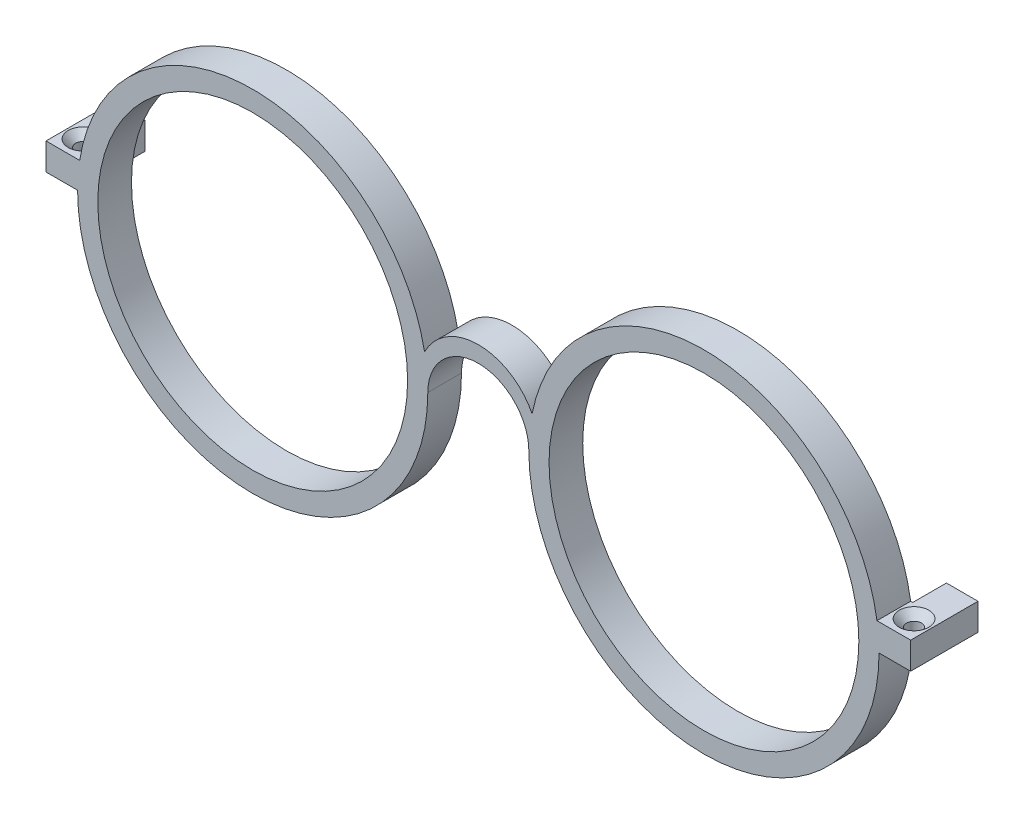
ISO-10303-21;
HEADER;
FILE_DESCRIPTION(('STEP AP214'),'2;1');
FILE_NAME('part.step','',(''),(''),'','','');
FILE_SCHEMA(('AUTOMOTIVE_DESIGN { 1 0 10303 214 1 1 1 1 }'));
ENDSEC;
DATA;
#1=APPLICATION_CONTEXT('core data for automotive mechanical design processes');
#2=APPLICATION_PROTOCOL_DEFINITION('international standard','automotive_design',2000,#1);
#3=PRODUCT_CONTEXT('',#1,'mechanical');
#4=PRODUCT('Part','Part','',(#3));
#5=PRODUCT_RELATED_PRODUCT_CATEGORY('part','',(#4));
#6=PRODUCT_DEFINITION_FORMATION('','',#4);
#7=PRODUCT_DEFINITION_CONTEXT('part definition',#1,'design');
#8=PRODUCT_DEFINITION('design','',#6,#7);
#9=PRODUCT_DEFINITION_SHAPE('','',#8);
#10=(LENGTH_UNIT() NAMED_UNIT(*) SI_UNIT(.MILLI.,.METRE.));
#11=(NAMED_UNIT(*) PLANE_ANGLE_UNIT() SI_UNIT($,.RADIAN.));
#12=(NAMED_UNIT(*) SI_UNIT($,.STERADIAN.) SOLID_ANGLE_UNIT());
#13=UNCERTAINTY_MEASURE_WITH_UNIT(LENGTH_MEASURE(1.E-05),#10,'distance_accuracy_value','');
#14=(GEOMETRIC_REPRESENTATION_CONTEXT(3) GLOBAL_UNCERTAINTY_ASSIGNED_CONTEXT((#13)) GLOBAL_UNIT_ASSIGNED_CONTEXT((#10,
#11,#12)) REPRESENTATION_CONTEXT('',''));
#15=CARTESIAN_POINT('',(0.,0.,0.));
#16=DIRECTION('',(0.,0.,1.));
#17=DIRECTION('',(1.,0.,0.));
#18=AXIS2_PLACEMENT_3D('',#15,#16,#17);
#19=CARTESIAN_POINT('',(0.,3.99999999999999,5.));
#20=DIRECTION('',(0.,-1.,0.));
#21=DIRECTION('',(1.,0.,0.));
#22=AXIS2_PLACEMENT_3D('',#19,#20,#21);
#23=PLANE('',#22);
#24=DIRECTION('',(0.,0.,-1.));
#25=VECTOR('',#24,1.);
#26=CARTESIAN_POINT('',(64.1904651573303,4.,5.));
#27=LINE('',#26,#25);
#28=CARTESIAN_POINT('',(64.1904651573303,4.,5.));
#29=VERTEX_POINT('',#28);
#30=CARTESIAN_POINT('',(64.1904651573303,4.,-5.));
#31=VERTEX_POINT('',#30);
#32=EDGE_CURVE('E191',#29,#31,#27,.T.);
#33=ORIENTED_EDGE('',*,*,#32,.T.);
#34=DIRECTION('',(1.,0.,0.));
#35=VECTOR('',#34,1.);
#36=CARTESIAN_POINT('',(64.1904651573303,4.,-5.));
#37=LINE('',#36,#35);
#38=CARTESIAN_POINT('',(59.5,4.,-5.));
#39=VERTEX_POINT('',#38);
#40=EDGE_CURVE('E234',#39,#31,#37,.T.);
#41=ORIENTED_EDGE('',*,*,#40,.F.);
#42=DIRECTION('',(0.,0.,1.));
#43=VECTOR('',#42,1.);
#44=CARTESIAN_POINT('',(59.5,4.,-5.));
#45=LINE('',#44,#43);
#46=CARTESIAN_POINT('',(59.5,4.,0.));
#47=VERTEX_POINT('',#46);
#48=EDGE_CURVE('E231',#39,#47,#45,.T.);
#49=ORIENTED_EDGE('',*,*,#48,.T.);
#50=DIRECTION('',(-1.,0.,0.));
#51=VECTOR('',#50,1.);
#52=CARTESIAN_POINT('',(0.,3.99999999999999,0.));
#53=LINE('',#52,#51);
#54=CARTESIAN_POINT('',(59.1904651573303,4.,0.));
#55=VERTEX_POINT('',#54);
#56=EDGE_CURVE('E187',#47,#55,#53,.T.);
#57=ORIENTED_EDGE('',*,*,#56,.T.);
#58=DIRECTION('',(0.,0.,-1.));
#59=VECTOR('',#58,1.);
#60=CARTESIAN_POINT('',(59.1904651573303,4.,5.));
#61=LINE('',#60,#59);
#62=CARTESIAN_POINT('',(59.1904651573303,4.,5.));
#63=VERTEX_POINT('',#62);
#64=EDGE_CURVE('E183',#63,#55,#61,.T.);
#65=ORIENTED_EDGE('',*,*,#64,.F.);
#66=DIRECTION('',(-1.,0.,0.));
#67=VECTOR('',#66,1.);
#68=CARTESIAN_POINT('',(0.,3.99999999999999,5.));
#69=LINE('',#68,#67);
#70=EDGE_CURVE('E169',#29,#63,#69,.T.);
#71=ORIENTED_EDGE('',*,*,#70,.F.);
#72=EDGE_LOOP('',(#33,#41,#49,#57,#65,#71));
#73=FACE_BOUND('',#72,.T.);
#74=CARTESIAN_POINT('',(61.6904651573303,4.,2.));
#75=DIRECTION('',(0.,1.,0.));
#76=DIRECTION('',(0.,0.,1.));
#77=AXIS2_PLACEMENT_3D('',#74,#75,#76);
#78=CIRCLE('',#77,2.19999999999999);
#79=CARTESIAN_POINT('',(61.6904651573303,4.,4.19999999999999));
#80=VERTEX_POINT('',#79);
#81=EDGE_CURVE('E607',#80,#80,#78,.T.);
#82=ORIENTED_EDGE('',*,*,#81,.F.);
#83=EDGE_LOOP('',(#82));
#84=FACE_BOUND('',#83,.T.);
#85=ADVANCED_FACE('F75',(#73,#84),#23,.F.);
#86=CARTESIAN_POINT('',(0.,0.,0.));
#87=DIRECTION('',(0.,0.,1.));
#88=DIRECTION('',(1.,0.,0.));
#89=AXIS2_PLACEMENT_3D('',#86,#87,#88);
#90=PLANE('',#89);
#91=CARTESIAN_POINT('',(33.5,0.,0.));
#92=DIRECTION('',(0.,0.,1.));
#93=DIRECTION('',(1.,0.,0.));
#94=AXIS2_PLACEMENT_3D('',#91,#92,#93);
#95=CIRCLE('',#94,23.);
#96=CARTESIAN_POINT('',(56.5,0.,0.));
#97=VERTEX_POINT('',#96);
#98=EDGE_CURVE('E220',#97,#97,#95,.T.);
#99=ORIENTED_EDGE('',*,*,#98,.T.);
#100=EDGE_LOOP('',(#99));
#101=FACE_BOUND('',#100,.T.);
#102=CARTESIAN_POINT('',(-33.5,0.,0.));
#103=DIRECTION('',(0.,0.,1.));
#104=DIRECTION('',(1.,0.,0.));
#105=AXIS2_PLACEMENT_3D('',#102,#103,#104);
#106=CIRCLE('',#105,23.);
#107=CARTESIAN_POINT('',(-10.5,0.,0.));
#108=VERTEX_POINT('',#107);
#109=EDGE_CURVE('E221',#108,#108,#106,.T.);
#110=ORIENTED_EDGE('',*,*,#109,.T.);
#111=EDGE_LOOP('',(#110));
#112=FACE_BOUND('',#111,.T.);
#113=DIRECTION('',(0.,-1.,0.));
#114=VECTOR('',#113,1.);
#115=CARTESIAN_POINT('',(-59.5,4.,0.));
#116=LINE('',#115,#114);
#117=CARTESIAN_POINT('',(-59.5,4.,0.));
#118=VERTEX_POINT('',#117);
#119=CARTESIAN_POINT('',(-59.5,0.,0.));
#120=VERTEX_POINT('',#119);
#121=EDGE_CURVE('E92',#118,#120,#116,.T.);
#122=ORIENTED_EDGE('',*,*,#121,.F.);
#123=DIRECTION('',(1.,0.,0.));
#124=VECTOR('',#123,1.);
#125=CARTESIAN_POINT('',(0.,4.,0.));
#126=LINE('',#125,#124);
#127=CARTESIAN_POINT('',(-59.1904651573303,4.,0.));
#128=VERTEX_POINT('',#127);
#129=EDGE_CURVE('E364',#118,#128,#126,.T.);
#130=ORIENTED_EDGE('',*,*,#129,.T.);
#131=CARTESIAN_POINT('',(-33.5,0.,0.));
#132=DIRECTION('',(0.,0.,1.));
#133=DIRECTION('',(1.,0.,0.));
#134=AXIS2_PLACEMENT_3D('',#131,#132,#133);
#135=CIRCLE('',#134,26.);
#136=CARTESIAN_POINT('',(-7.98076923076923,4.97683242100289,0.));
#137=VERTEX_POINT('',#136);
#138=EDGE_CURVE('E228',#137,#128,#135,.T.);
#139=ORIENTED_EDGE('',*,*,#138,.F.);
#140=CARTESIAN_POINT('',(0.00809188612239681,0.972483266629338,0.));
#141=DIRECTION('',(0.,0.,1.));
#142=DIRECTION('',(1.,0.,0.));
#143=AXIS2_PLACEMENT_3D('',#140,#141,#142);
#144=CIRCLE('',#143,8.93625839460315);
#145=CARTESIAN_POINT('',(7.98529835565385,5.00000000000003,0.));
#146=VERTEX_POINT('',#145);
#147=EDGE_CURVE('E353',#137,#146,#144,.F.);
#148=ORIENTED_EDGE('',*,*,#147,.T.);
#149=CARTESIAN_POINT('',(33.5,0.,0.));
#150=DIRECTION('',(0.,0.,1.));
#151=DIRECTION('',(1.,0.,0.));
#152=AXIS2_PLACEMENT_3D('',#149,#150,#151);
#153=CIRCLE('',#152,26.);
#154=EDGE_CURVE('E355',#55,#146,#153,.T.);
#155=ORIENTED_EDGE('',*,*,#154,.F.);
#156=ORIENTED_EDGE('',*,*,#56,.F.);
#157=DIRECTION('',(0.,1.,0.));
#158=VECTOR('',#157,1.);
#159=CARTESIAN_POINT('',(59.5,4.,0.));
#160=LINE('',#159,#158);
#161=CARTESIAN_POINT('',(59.5,0.,0.));
#162=VERTEX_POINT('',#161);
#163=EDGE_CURVE('E237',#162,#47,#160,.T.);
#164=ORIENTED_EDGE('',*,*,#163,.F.);
#165=CARTESIAN_POINT('',(7.49999999999999,0.,0.));
#166=VERTEX_POINT('',#165);
#167=EDGE_CURVE('E358',#166,#162,#153,.T.);
#168=ORIENTED_EDGE('',*,*,#167,.F.);
#169=CARTESIAN_POINT('',(0.,0.,0.));
#170=DIRECTION('',(0.,0.,1.));
#171=DIRECTION('',(1.,0.,0.));
#172=AXIS2_PLACEMENT_3D('',#169,#170,#171);
#173=CIRCLE('',#172,7.49999999999999);
#174=CARTESIAN_POINT('',(-7.5,0.,0.));
#175=VERTEX_POINT('',#174);
#176=EDGE_CURVE('E361',#175,#166,#173,.F.);
#177=ORIENTED_EDGE('',*,*,#176,.F.);
#178=EDGE_CURVE('E363',#120,#175,#135,.T.);
#179=ORIENTED_EDGE('',*,*,#178,.F.);
#180=EDGE_LOOP('',(#122,#130,#139,#148,#155,#156,#164,#168,#177,#179));
#181=FACE_BOUND('',#180,.T.);
#182=ADVANCED_FACE('F376',(#101,#112,#181),#90,.F.);
#183=CARTESIAN_POINT('',(0.,0.,5.));
#184=DIRECTION('',(0.,0.,1.));
#185=DIRECTION('',(1.,0.,0.));
#186=AXIS2_PLACEMENT_3D('',#183,#184,#185);
#187=PLANE('',#186);
#188=CARTESIAN_POINT('',(33.5,0.,5.));
#189=DIRECTION('',(0.,0.,1.));
#190=DIRECTION('',(1.,0.,0.));
#191=AXIS2_PLACEMENT_3D('',#188,#189,#190);
#192=CIRCLE('',#191,23.);
#193=CARTESIAN_POINT('',(56.5,0.,5.));
#194=VERTEX_POINT('',#193);
#195=EDGE_CURVE('E198',#194,#194,#192,.T.);
#196=ORIENTED_EDGE('',*,*,#195,.F.);
#197=EDGE_LOOP('',(#196));
#198=FACE_BOUND('',#197,.T.);
#199=CARTESIAN_POINT('',(-33.5,0.,5.));
#200=DIRECTION('',(0.,0.,1.));
#201=DIRECTION('',(1.,0.,0.));
#202=AXIS2_PLACEMENT_3D('',#199,#200,#201);
#203=CIRCLE('',#202,26.);
#204=CARTESIAN_POINT('',(-7.98076923076923,4.97683242100289,5.));
#205=VERTEX_POINT('',#204);
#206=CARTESIAN_POINT('',(-59.1904651573303,4.,5.));
#207=VERTEX_POINT('',#206);
#208=EDGE_CURVE('E139',#205,#207,#203,.T.);
#209=ORIENTED_EDGE('',*,*,#208,.T.);
#210=DIRECTION('',(1.,0.,0.));
#211=VECTOR('',#210,1.);
#212=CARTESIAN_POINT('',(0.,4.,5.));
#213=LINE('',#212,#211);
#214=CARTESIAN_POINT('',(-64.1904651573303,4.,5.));
#215=VERTEX_POINT('',#214);
#216=EDGE_CURVE('E217',#215,#207,#213,.T.);
#217=ORIENTED_EDGE('',*,*,#216,.F.);
#218=DIRECTION('',(0.,1.,0.));
#219=VECTOR('',#218,1.);
#220=CARTESIAN_POINT('',(-64.1904651573303,0.,5.));
#221=LINE('',#220,#219);
#222=CARTESIAN_POINT('',(-64.1904651573303,0.,5.));
#223=VERTEX_POINT('',#222);
#224=EDGE_CURVE('E214',#223,#215,#221,.T.);
#225=ORIENTED_EDGE('',*,*,#224,.F.);
#226=DIRECTION('',(-1.,0.,0.));
#227=VECTOR('',#226,1.);
#228=CARTESIAN_POINT('',(0.,0.,5.));
#229=LINE('',#228,#227);
#230=CARTESIAN_POINT('',(-59.5,0.,5.));
#231=VERTEX_POINT('',#230);
#232=EDGE_CURVE('E209',#231,#223,#229,.T.);
#233=ORIENTED_EDGE('',*,*,#232,.F.);
#234=CARTESIAN_POINT('',(-7.5,0.,5.));
#235=VERTEX_POINT('',#234);
#236=EDGE_CURVE('E206',#231,#235,#203,.T.);
#237=ORIENTED_EDGE('',*,*,#236,.T.);
#238=CARTESIAN_POINT('',(0.,0.,5.));
#239=DIRECTION('',(0.,0.,1.));
#240=DIRECTION('',(1.,0.,0.));
#241=AXIS2_PLACEMENT_3D('',#238,#239,#240);
#242=CIRCLE('',#241,7.49999999999999);
#243=CARTESIAN_POINT('',(7.49999999999999,0.,5.));
#244=VERTEX_POINT('',#243);
#245=EDGE_CURVE('E203',#235,#244,#242,.F.);
#246=ORIENTED_EDGE('',*,*,#245,.T.);
#247=CARTESIAN_POINT('',(33.5,0.,5.));
#248=DIRECTION('',(0.,0.,1.));
#249=DIRECTION('',(1.,0.,0.));
#250=AXIS2_PLACEMENT_3D('',#247,#248,#249);
#251=CIRCLE('',#250,26.);
#252=CARTESIAN_POINT('',(59.5,0.,5.));
#253=VERTEX_POINT('',#252);
#254=EDGE_CURVE('E197',#244,#253,#251,.T.);
#255=ORIENTED_EDGE('',*,*,#254,.T.);
#256=DIRECTION('',(1.,0.,0.));
#257=VECTOR('',#256,1.);
#258=CARTESIAN_POINT('',(0.,0.,5.));
#259=LINE('',#258,#257);
#260=CARTESIAN_POINT('',(64.1904651573303,0.,5.));
#261=VERTEX_POINT('',#260);
#262=EDGE_CURVE('E202',#253,#261,#259,.T.);
#263=ORIENTED_EDGE('',*,*,#262,.T.);
#264=DIRECTION('',(0.,1.,0.));
#265=VECTOR('',#264,1.);
#266=CARTESIAN_POINT('',(64.1904651573303,0.,5.));
#267=LINE('',#266,#265);
#268=EDGE_CURVE('E177',#261,#29,#267,.T.);
#269=ORIENTED_EDGE('',*,*,#268,.T.);
#270=ORIENTED_EDGE('',*,*,#70,.T.);
#271=CARTESIAN_POINT('',(7.98529835565385,5.00000000000003,5.));
#272=VERTEX_POINT('',#271);
#273=EDGE_CURVE('E174',#63,#272,#251,.T.);
#274=ORIENTED_EDGE('',*,*,#273,.T.);
#275=CARTESIAN_POINT('',(0.00809188612239681,0.972483266629338,5.));
#276=DIRECTION('',(0.,0.,1.));
#277=DIRECTION('',(1.,0.,0.));
#278=AXIS2_PLACEMENT_3D('',#275,#276,#277);
#279=CIRCLE('',#278,8.93625839460315);
#280=EDGE_CURVE('E195',#205,#272,#279,.F.);
#281=ORIENTED_EDGE('',*,*,#280,.F.);
#282=EDGE_LOOP('',(#209,#217,#225,#233,#237,#246,#255,#263,#269,#270,#274,#281));
#283=FACE_BOUND('',#282,.T.);
#284=CARTESIAN_POINT('',(-33.5,0.,5.));
#285=DIRECTION('',(0.,0.,1.));
#286=DIRECTION('',(1.,0.,0.));
#287=AXIS2_PLACEMENT_3D('',#284,#285,#286);
#288=CIRCLE('',#287,23.);
#289=CARTESIAN_POINT('',(-10.5,0.,5.));
#290=VERTEX_POINT('',#289);
#291=EDGE_CURVE('E224',#290,#290,#288,.T.);
#292=ORIENTED_EDGE('',*,*,#291,.F.);
#293=EDGE_LOOP('',(#292));
#294=FACE_BOUND('',#293,.T.);
#295=ADVANCED_FACE('F171',(#198,#283,#294),#187,.T.);
#296=CARTESIAN_POINT('',(-33.5,0.,5.));
#297=DIRECTION('',(0.,0.,-1.));
#298=DIRECTION('',(-1.,0.,0.));
#299=AXIS2_PLACEMENT_3D('',#296,#297,#298);
#300=CYLINDRICAL_SURFACE('',#299,26.);
#301=ORIENTED_EDGE('',*,*,#138,.T.);
#302=DIRECTION('',(0.,0.,-1.));
#303=VECTOR('',#302,1.);
#304=CARTESIAN_POINT('',(-59.1904651573303,4.,5.));
#305=LINE('',#304,#303);
#306=EDGE_CURVE('E12',#207,#128,#305,.T.);
#307=ORIENTED_EDGE('',*,*,#306,.F.);
#308=ORIENTED_EDGE('',*,*,#208,.F.);
#309=DIRECTION('',(0.,0.,-1.));
#310=VECTOR('',#309,1.);
#311=CARTESIAN_POINT('',(-7.98076923076923,4.97683242100289,5.));
#312=LINE('',#311,#310);
#313=EDGE_CURVE('E101',#205,#137,#312,.T.);
#314=ORIENTED_EDGE('',*,*,#313,.T.);
#315=EDGE_LOOP('',(#301,#307,#308,#314));
#316=FACE_BOUND('',#315,.T.);
#317=ADVANCED_FACE('F375',(#316),#300,.T.);
#318=CARTESIAN_POINT('',(0.,4.,5.));
#319=DIRECTION('',(0.,1.,0.));
#320=DIRECTION('',(0.,0.,1.));
#321=AXIS2_PLACEMENT_3D('',#318,#319,#320);
#322=PLANE('',#321);
#323=CARTESIAN_POINT('',(-61.6904651573303,3.99999999999998,2.));
#324=DIRECTION('',(0.,1.,0.));
#325=DIRECTION('',(0.,0.,1.));
#326=AXIS2_PLACEMENT_3D('',#323,#324,#325);
#327=CIRCLE('',#326,2.2);
#328=CARTESIAN_POINT('',(-61.6904651573303,3.99999999999998,4.2));
#329=VERTEX_POINT('',#328);
#330=EDGE_CURVE('E254',#329,#329,#327,.T.);
#331=ORIENTED_EDGE('',*,*,#330,.F.);
#332=EDGE_LOOP('',(#331));
#333=FACE_BOUND('',#332,.T.);
#334=ORIENTED_EDGE('',*,*,#129,.F.);
#335=DIRECTION('',(0.,0.,1.));
#336=VECTOR('',#335,1.);
#337=CARTESIAN_POINT('',(-59.5,4.,-5.));
#338=LINE('',#337,#336);
#339=CARTESIAN_POINT('',(-59.5,4.,-5.));
#340=VERTEX_POINT('',#339);
#341=EDGE_CURVE('E242',#340,#118,#338,.T.);
#342=ORIENTED_EDGE('',*,*,#341,.F.);
#343=DIRECTION('',(1.,0.,0.));
#344=VECTOR('',#343,1.);
#345=CARTESIAN_POINT('',(-64.1904651573303,4.,-5.));
#346=LINE('',#345,#344);
#347=CARTESIAN_POINT('',(-64.1904651573303,4.,-5.));
#348=VERTEX_POINT('',#347);
#349=EDGE_CURVE('E264',#348,#340,#346,.T.);
#350=ORIENTED_EDGE('',*,*,#349,.F.);
#351=DIRECTION('',(0.,0.,-1.));
#352=VECTOR('',#351,1.);
#353=CARTESIAN_POINT('',(-64.1904651573303,4.,5.));
#354=LINE('',#353,#352);
#355=EDGE_CURVE('E84',#215,#348,#354,.T.);
#356=ORIENTED_EDGE('',*,*,#355,.F.);
#357=ORIENTED_EDGE('',*,*,#216,.T.);
#358=ORIENTED_EDGE('',*,*,#306,.T.);
#359=EDGE_LOOP('',(#334,#342,#350,#356,#357,#358));
#360=FACE_BOUND('',#359,.T.);
#361=ADVANCED_FACE('F77',(#333,#360),#322,.T.);
#362=CARTESIAN_POINT('',(-64.1904651573303,0.,5.));
#363=DIRECTION('',(-1.,0.,0.));
#364=DIRECTION('',(0.,0.,1.));
#365=AXIS2_PLACEMENT_3D('',#362,#363,#364);
#366=PLANE('',#365);
#367=ORIENTED_EDGE('',*,*,#355,.T.);
#368=DIRECTION('',(0.,1.,0.));
#369=VECTOR('',#368,1.);
#370=CARTESIAN_POINT('',(-64.1904651573303,4.,-5.));
#371=LINE('',#370,#369);
#372=CARTESIAN_POINT('',(-64.1904651573303,0.,-5.));
#373=VERTEX_POINT('',#372);
#374=EDGE_CURVE('E251',#373,#348,#371,.T.);
#375=ORIENTED_EDGE('',*,*,#374,.F.);
#376=DIRECTION('',(0.,0.,-1.));
#377=VECTOR('',#376,1.);
#378=CARTESIAN_POINT('',(-64.1904651573303,0.,5.));
#379=LINE('',#378,#377);
#380=EDGE_CURVE('E326',#223,#373,#379,.T.);
#381=ORIENTED_EDGE('',*,*,#380,.F.);
#382=ORIENTED_EDGE('',*,*,#224,.T.);
#383=EDGE_LOOP('',(#367,#375,#381,#382));
#384=FACE_BOUND('',#383,.T.);
#385=ADVANCED_FACE('F323',(#384),#366,.T.);
#386=CARTESIAN_POINT('',(0.,0.,5.));
#387=DIRECTION('',(0.,-1.,0.));
#388=DIRECTION('',(1.,0.,0.));
#389=AXIS2_PLACEMENT_3D('',#386,#387,#388);
#390=PLANE('',#389);
#391=CARTESIAN_POINT('',(-61.6904651573303,0.,2.));
#392=DIRECTION('',(0.,-1.,0.));
#393=DIRECTION('',(1.,0.,0.));
#394=AXIS2_PLACEMENT_3D('',#391,#392,#393);
#395=CIRCLE('',#394,1.09999999999999);
#396=CARTESIAN_POINT('',(-60.5904651573303,0.,2.));
#397=VERTEX_POINT('',#396);
#398=EDGE_CURVE('E246',#397,#397,#395,.T.);
#399=ORIENTED_EDGE('',*,*,#398,.F.);
#400=EDGE_LOOP('',(#399));
#401=FACE_BOUND('',#400,.T.);
#402=ORIENTED_EDGE('',*,*,#380,.T.);
#403=DIRECTION('',(-1.,0.,0.));
#404=VECTOR('',#403,1.);
#405=CARTESIAN_POINT('',(-64.1904651573303,0.,-5.));
#406=LINE('',#405,#404);
#407=CARTESIAN_POINT('',(-59.5,0.,-5.));
#408=VERTEX_POINT('',#407);
#409=EDGE_CURVE('E270',#408,#373,#406,.T.);
#410=ORIENTED_EDGE('',*,*,#409,.F.);
#411=DIRECTION('',(0.,0.,1.));
#412=VECTOR('',#411,1.);
#413=CARTESIAN_POINT('',(-59.5,0.,-5.));
#414=LINE('',#413,#412);
#415=EDGE_CURVE('E272',#408,#120,#414,.T.);
#416=ORIENTED_EDGE('',*,*,#415,.T.);
#417=DIRECTION('',(0.,0.,-1.));
#418=VECTOR('',#417,1.);
#419=CARTESIAN_POINT('',(-59.5,0.,5.));
#420=LINE('',#419,#418);
#421=EDGE_CURVE('E337',#231,#120,#420,.T.);
#422=ORIENTED_EDGE('',*,*,#421,.F.);
#423=ORIENTED_EDGE('',*,*,#232,.T.);
#424=EDGE_LOOP('',(#402,#410,#416,#422,#423));
#425=FACE_BOUND('',#424,.T.);
#426=ADVANCED_FACE('F335',(#401,#425),#390,.T.);
#427=ORIENTED_EDGE('',*,*,#178,.T.);
#428=DIRECTION('',(0.,0.,-1.));
#429=VECTOR('',#428,1.);
#430=CARTESIAN_POINT('',(-7.5,0.,5.));
#431=LINE('',#430,#429);
#432=EDGE_CURVE('E339',#235,#175,#431,.T.);
#433=ORIENTED_EDGE('',*,*,#432,.F.);
#434=ORIENTED_EDGE('',*,*,#236,.F.);
#435=ORIENTED_EDGE('',*,*,#421,.T.);
#436=EDGE_LOOP('',(#427,#433,#434,#435));
#437=FACE_BOUND('',#436,.T.);
#438=ADVANCED_FACE('F383',(#437),#300,.T.);
#439=CARTESIAN_POINT('',(0.,0.,5.));
#440=DIRECTION('',(0.,0.,-1.));
#441=DIRECTION('',(-1.,0.,0.));
#442=AXIS2_PLACEMENT_3D('',#439,#440,#441);
#443=CYLINDRICAL_SURFACE('',#442,7.49999999999999);
#444=ORIENTED_EDGE('',*,*,#176,.T.);
#445=DIRECTION('',(0.,0.,-1.));
#446=VECTOR('',#445,1.);
#447=CARTESIAN_POINT('',(7.49999999999999,0.,5.));
#448=LINE('',#447,#446);
#449=EDGE_CURVE('E344',#244,#166,#448,.T.);
#450=ORIENTED_EDGE('',*,*,#449,.F.);
#451=ORIENTED_EDGE('',*,*,#245,.F.);
#452=ORIENTED_EDGE('',*,*,#432,.T.);
#453=EDGE_LOOP('',(#444,#450,#451,#452));
#454=FACE_BOUND('',#453,.T.);
#455=ADVANCED_FACE('F400',(#454),#443,.F.);
#456=CARTESIAN_POINT('',(33.5,0.,5.));
#457=DIRECTION('',(0.,0.,-1.));
#458=DIRECTION('',(-1.,0.,0.));
#459=AXIS2_PLACEMENT_3D('',#456,#457,#458);
#460=CYLINDRICAL_SURFACE('',#459,26.);
#461=ORIENTED_EDGE('',*,*,#167,.T.);
#462=DIRECTION('',(0.,0.,-1.));
#463=VECTOR('',#462,1.);
#464=CARTESIAN_POINT('',(59.5,0.,5.));
#465=LINE('',#464,#463);
#466=EDGE_CURVE('E303',#253,#162,#465,.T.);
#467=ORIENTED_EDGE('',*,*,#466,.F.);
#468=ORIENTED_EDGE('',*,*,#254,.F.);
#469=ORIENTED_EDGE('',*,*,#449,.T.);
#470=EDGE_LOOP('',(#461,#467,#468,#469));
#471=FACE_BOUND('',#470,.T.);
#472=ADVANCED_FACE('F398',(#471),#460,.T.);
#473=CARTESIAN_POINT('',(0.,0.,5.));
#474=DIRECTION('',(0.,1.,0.));
#475=DIRECTION('',(0.,0.,1.));
#476=AXIS2_PLACEMENT_3D('',#473,#474,#475);
#477=PLANE('',#476);
#478=CARTESIAN_POINT('',(61.6904651573303,0.,2.));
#479=DIRECTION('',(0.,1.,0.));
#480=DIRECTION('',(0.,0.,1.));
#481=AXIS2_PLACEMENT_3D('',#478,#479,#480);
#482=CIRCLE('',#481,1.09999999999999);
#483=CARTESIAN_POINT('',(61.6904651573303,0.,3.09999999999999));
#484=VERTEX_POINT('',#483);
#485=EDGE_CURVE('E79',#484,#484,#482,.T.);
#486=ORIENTED_EDGE('',*,*,#485,.T.);
#487=EDGE_LOOP('',(#486));
#488=FACE_BOUND('',#487,.T.);
#489=ORIENTED_EDGE('',*,*,#466,.T.);
#490=DIRECTION('',(0.,0.,1.));
#491=VECTOR('',#490,1.);
#492=CARTESIAN_POINT('',(59.5,0.,-5.));
#493=LINE('',#492,#491);
#494=CARTESIAN_POINT('',(59.5,0.,-5.));
#495=VERTEX_POINT('',#494);
#496=EDGE_CURVE('E225',#495,#162,#493,.T.);
#497=ORIENTED_EDGE('',*,*,#496,.F.);
#498=DIRECTION('',(-1.,0.,0.));
#499=VECTOR('',#498,1.);
#500=CARTESIAN_POINT('',(64.1904651573303,0.,-5.));
#501=LINE('',#500,#499);
#502=CARTESIAN_POINT('',(64.1904651573303,0.,-5.));
#503=VERTEX_POINT('',#502);
#504=EDGE_CURVE('E280',#503,#495,#501,.T.);
#505=ORIENTED_EDGE('',*,*,#504,.F.);
#506=DIRECTION('',(0.,0.,-1.));
#507=VECTOR('',#506,1.);
#508=CARTESIAN_POINT('',(64.1904651573303,0.,5.));
#509=LINE('',#508,#507);
#510=EDGE_CURVE('E297',#261,#503,#509,.T.);
#511=ORIENTED_EDGE('',*,*,#510,.F.);
#512=ORIENTED_EDGE('',*,*,#262,.F.);
#513=EDGE_LOOP('',(#489,#497,#505,#511,#512));
#514=FACE_BOUND('',#513,.T.);
#515=ADVANCED_FACE('F307',(#488,#514),#477,.F.);
#516=CARTESIAN_POINT('',(64.1904651573303,0.,5.));
#517=DIRECTION('',(-1.,0.,0.));
#518=DIRECTION('',(0.,0.,1.));
#519=AXIS2_PLACEMENT_3D('',#516,#517,#518);
#520=PLANE('',#519);
#521=ORIENTED_EDGE('',*,*,#510,.T.);
#522=DIRECTION('',(0.,-1.,0.));
#523=VECTOR('',#522,1.);
#524=CARTESIAN_POINT('',(64.1904651573303,4.,-5.));
#525=LINE('',#524,#523);
#526=EDGE_CURVE('E241',#31,#503,#525,.T.);
#527=ORIENTED_EDGE('',*,*,#526,.F.);
#528=ORIENTED_EDGE('',*,*,#32,.F.);
#529=ORIENTED_EDGE('',*,*,#268,.F.);
#530=EDGE_LOOP('',(#521,#527,#528,#529));
#531=FACE_BOUND('',#530,.T.);
#532=ADVANCED_FACE('F295',(#531),#520,.F.);
#533=ORIENTED_EDGE('',*,*,#154,.T.);
#534=DIRECTION('',(0.,0.,-1.));
#535=VECTOR('',#534,1.);
#536=CARTESIAN_POINT('',(7.98529835565385,5.00000000000003,5.));
#537=LINE('',#536,#535);
#538=EDGE_CURVE('E192',#272,#146,#537,.T.);
#539=ORIENTED_EDGE('',*,*,#538,.F.);
#540=ORIENTED_EDGE('',*,*,#273,.F.);
#541=ORIENTED_EDGE('',*,*,#64,.T.);
#542=EDGE_LOOP('',(#533,#539,#540,#541));
#543=FACE_BOUND('',#542,.T.);
#544=ADVANCED_FACE('F194',(#543),#460,.T.);
#545=CARTESIAN_POINT('',(0.00809188612239681,0.972483266629338,5.));
#546=DIRECTION('',(0.,0.,-1.));
#547=DIRECTION('',(-1.,0.,0.));
#548=AXIS2_PLACEMENT_3D('',#545,#546,#547);
#549=CYLINDRICAL_SURFACE('',#548,8.93625839460315);
#550=ORIENTED_EDGE('',*,*,#147,.F.);
#551=ORIENTED_EDGE('',*,*,#313,.F.);
#552=ORIENTED_EDGE('',*,*,#280,.T.);
#553=ORIENTED_EDGE('',*,*,#538,.T.);
#554=EDGE_LOOP('',(#550,#551,#552,#553));
#555=FACE_BOUND('',#554,.T.);
#556=ADVANCED_FACE('F450',(#555),#549,.T.);
#557=CARTESIAN_POINT('',(33.5,0.,5.));
#558=DIRECTION('',(0.,0.,-1.));
#559=DIRECTION('',(-1.,0.,0.));
#560=AXIS2_PLACEMENT_3D('',#557,#558,#559);
#561=CYLINDRICAL_SURFACE('',#560,23.);
#562=ORIENTED_EDGE('',*,*,#195,.T.);
#563=EDGE_LOOP('',(#562));
#564=FACE_BOUND('',#563,.T.);
#565=ORIENTED_EDGE('',*,*,#98,.F.);
#566=EDGE_LOOP('',(#565));
#567=FACE_BOUND('',#566,.T.);
#568=ADVANCED_FACE('F371',(#564,#567),#561,.F.);
#569=CARTESIAN_POINT('',(-33.5,0.,5.));
#570=DIRECTION('',(0.,0.,-1.));
#571=DIRECTION('',(-1.,0.,0.));
#572=AXIS2_PLACEMENT_3D('',#569,#570,#571);
#573=CYLINDRICAL_SURFACE('',#572,23.);
#574=ORIENTED_EDGE('',*,*,#291,.T.);
#575=EDGE_LOOP('',(#574));
#576=FACE_BOUND('',#575,.T.);
#577=ORIENTED_EDGE('',*,*,#109,.F.);
#578=EDGE_LOOP('',(#577));
#579=FACE_BOUND('',#578,.T.);
#580=ADVANCED_FACE('F443',(#576,#579),#573,.F.);
#581=CARTESIAN_POINT('',(59.5,4.,-5.));
#582=DIRECTION('',(1.,0.,0.));
#583=DIRECTION('',(0.,0.,-1.));
#584=AXIS2_PLACEMENT_3D('',#581,#582,#583);
#585=PLANE('',#584);
#586=ORIENTED_EDGE('',*,*,#163,.T.);
#587=ORIENTED_EDGE('',*,*,#48,.F.);
#588=DIRECTION('',(0.,1.,0.));
#589=VECTOR('',#588,1.);
#590=CARTESIAN_POINT('',(59.5,4.,-5.));
#591=LINE('',#590,#589);
#592=EDGE_CURVE('E282',#495,#39,#591,.T.);
#593=ORIENTED_EDGE('',*,*,#592,.F.);
#594=ORIENTED_EDGE('',*,*,#496,.T.);
#595=EDGE_LOOP('',(#586,#587,#593,#594));
#596=FACE_BOUND('',#595,.T.);
#597=ADVANCED_FACE('F441',(#596),#585,.F.);
#598=CARTESIAN_POINT('',(0.,0.,-5.));
#599=DIRECTION('',(0.,0.,-1.));
#600=DIRECTION('',(-1.,0.,0.));
#601=AXIS2_PLACEMENT_3D('',#598,#599,#600);
#602=PLANE('',#601);
#603=ORIENTED_EDGE('',*,*,#526,.T.);
#604=ORIENTED_EDGE('',*,*,#504,.T.);
#605=ORIENTED_EDGE('',*,*,#592,.T.);
#606=ORIENTED_EDGE('',*,*,#40,.T.);
#607=EDGE_LOOP('',(#603,#604,#605,#606));
#608=FACE_BOUND('',#607,.T.);
#609=ADVANCED_FACE('F291',(#608),#602,.T.);
#610=CARTESIAN_POINT('',(-59.5,4.,-5.));
#611=DIRECTION('',(-1.,0.,0.));
#612=DIRECTION('',(0.,0.,1.));
#613=AXIS2_PLACEMENT_3D('',#610,#611,#612);
#614=PLANE('',#613);
#615=ORIENTED_EDGE('',*,*,#121,.T.);
#616=ORIENTED_EDGE('',*,*,#415,.F.);
#617=DIRECTION('',(0.,-1.,0.));
#618=VECTOR('',#617,1.);
#619=CARTESIAN_POINT('',(-59.5,4.,-5.));
#620=LINE('',#619,#618);
#621=EDGE_CURVE('E267',#340,#408,#620,.T.);
#622=ORIENTED_EDGE('',*,*,#621,.F.);
#623=ORIENTED_EDGE('',*,*,#341,.T.);
#624=EDGE_LOOP('',(#615,#616,#622,#623));
#625=FACE_BOUND('',#624,.T.);
#626=ADVANCED_FACE('F435',(#625),#614,.F.);
#627=CARTESIAN_POINT('',(0.,0.,-5.));
#628=DIRECTION('',(0.,0.,1.));
#629=DIRECTION('',(1.,0.,0.));
#630=AXIS2_PLACEMENT_3D('',#627,#628,#629);
#631=PLANE('',#630);
#632=ORIENTED_EDGE('',*,*,#374,.T.);
#633=ORIENTED_EDGE('',*,*,#349,.T.);
#634=ORIENTED_EDGE('',*,*,#621,.T.);
#635=ORIENTED_EDGE('',*,*,#409,.T.);
#636=EDGE_LOOP('',(#632,#633,#634,#635));
#637=FACE_BOUND('',#636,.T.);
#638=ADVANCED_FACE('F331',(#637),#631,.F.);
#639=CARTESIAN_POINT('',(-61.6904651573303,3.99999999999998,2.));
#640=DIRECTION('',(0.,1.,0.));
#641=DIRECTION('',(0.,0.,1.));
#642=AXIS2_PLACEMENT_3D('',#639,#640,#641);
#643=CYLINDRICAL_SURFACE('',#642,1.09999999999999);
#644=ORIENTED_EDGE('',*,*,#398,.T.);
#645=EDGE_LOOP('',(#644));
#646=FACE_BOUND('',#645,.T.);
#647=CARTESIAN_POINT('',(-61.6904651573303,2.89999999999997,2.));
#648=DIRECTION('',(0.,1.,0.));
#649=DIRECTION('',(0.,0.,1.));
#650=AXIS2_PLACEMENT_3D('',#647,#648,#649);
#651=CIRCLE('',#650,1.1);
#652=CARTESIAN_POINT('',(-61.6904651573303,2.89999999999997,3.1));
#653=VERTEX_POINT('',#652);
#654=EDGE_CURVE('E248',#653,#653,#651,.T.);
#655=ORIENTED_EDGE('',*,*,#654,.T.);
#656=EDGE_LOOP('',(#655));
#657=FACE_BOUND('',#656,.T.);
#658=ADVANCED_FACE('F420',(#646,#657),#643,.F.);
#659=CARTESIAN_POINT('',(-61.6904651573303,3.99999999999998,2.));
#660=DIRECTION('',(0.,1.,0.));
#661=DIRECTION('',(0.,0.,1.));
#662=AXIS2_PLACEMENT_3D('',#659,#660,#661);
#663=CONICAL_SURFACE('',#662,2.2,0.785398163397445);
#664=ORIENTED_EDGE('',*,*,#654,.F.);
#665=EDGE_LOOP('',(#664));
#666=FACE_BOUND('',#665,.T.);
#667=ORIENTED_EDGE('',*,*,#330,.T.);
#668=EDGE_LOOP('',(#667));
#669=FACE_BOUND('',#668,.T.);
#670=ADVANCED_FACE('F417',(#666,#669),#663,.F.);
#671=CARTESIAN_POINT('',(61.6904651573303,4.,2.));
#672=DIRECTION('',(0.,1.,0.));
#673=DIRECTION('',(0.,0.,1.));
#674=AXIS2_PLACEMENT_3D('',#671,#672,#673);
#675=CYLINDRICAL_SURFACE('',#674,1.09999999999999);
#676=CARTESIAN_POINT('',(61.6904651573303,2.89999999999999,2.));
#677=DIRECTION('',(0.,1.,0.));
#678=DIRECTION('',(0.,0.,1.));
#679=AXIS2_PLACEMENT_3D('',#676,#677,#678);
#680=CIRCLE('',#679,1.09999999999999);
#681=CARTESIAN_POINT('',(61.6904651573303,2.89999999999999,3.09999999999999));
#682=VERTEX_POINT('',#681);
#683=EDGE_CURVE('E604',#682,#682,#680,.T.);
#684=ORIENTED_EDGE('',*,*,#683,.T.);
#685=EDGE_LOOP('',(#684));
#686=FACE_BOUND('',#685,.T.);
#687=ORIENTED_EDGE('',*,*,#485,.F.);
#688=EDGE_LOOP('',(#687));
#689=FACE_BOUND('',#688,.T.);
#690=ADVANCED_FACE('F419',(#686,#689),#675,.F.);
#691=CARTESIAN_POINT('',(61.6904651573303,4.,2.));
#692=DIRECTION('',(0.,1.,0.));
#693=DIRECTION('',(0.,0.,1.));
#694=AXIS2_PLACEMENT_3D('',#691,#692,#693);
#695=CONICAL_SURFACE('',#694,2.19999999999999,0.785398163397445);
#696=ORIENTED_EDGE('',*,*,#683,.F.);
#697=EDGE_LOOP('',(#696));
#698=FACE_BOUND('',#697,.T.);
#699=ORIENTED_EDGE('',*,*,#81,.T.);
#700=EDGE_LOOP('',(#699));
#701=FACE_BOUND('',#700,.T.);
#702=ADVANCED_FACE('F427',(#698,#701),#695,.F.);
#703=CLOSED_SHELL('',(#85,#182,#295,#317,#361,#385,#426,#438,#455,#472,#515,#532,#544,#556,#568,
#580,#597,#609,#626,#638,#658,#670,#690,#702));
#704=MANIFOLD_SOLID_BREP('B2',#703);
#705=ADVANCED_BREP_SHAPE_REPRESENTATION('',(#18,#704),#14);
#706=SHAPE_DEFINITION_REPRESENTATION(#9,#705);
ENDSEC;
END-ISO-10303-21;
